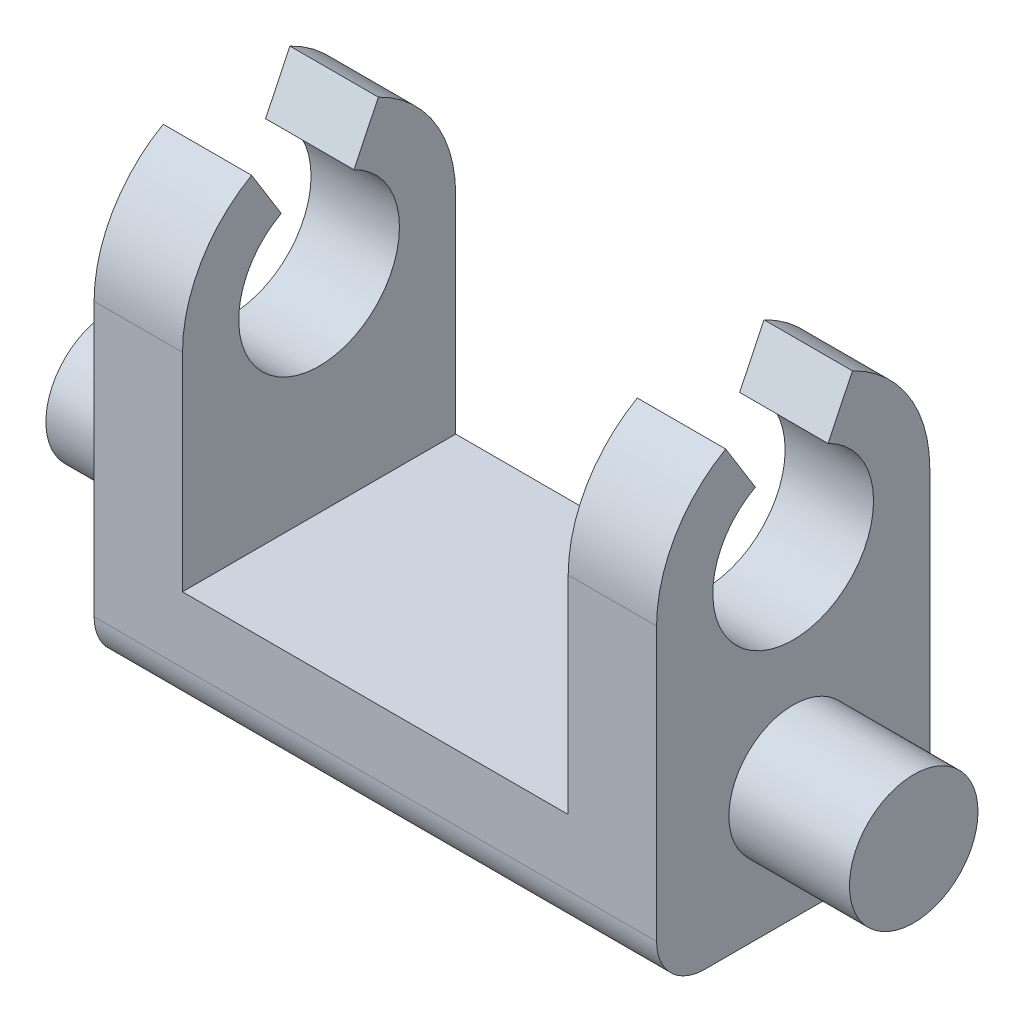
ISO-10303-21;
HEADER;
FILE_DESCRIPTION(('STEP AP214'),'2;1');
FILE_NAME('part.step','',(''),(''),'','','');
FILE_SCHEMA(('AUTOMOTIVE_DESIGN { 1 0 10303 214 1 1 1 1 }'));
ENDSEC;
DATA;
#1=APPLICATION_CONTEXT('core data for automotive mechanical design processes');
#2=APPLICATION_PROTOCOL_DEFINITION('international standard','automotive_design',2000,#1);
#3=PRODUCT_CONTEXT('',#1,'mechanical');
#4=PRODUCT('Part','Part','',(#3));
#5=PRODUCT_RELATED_PRODUCT_CATEGORY('part','',(#4));
#6=PRODUCT_DEFINITION_FORMATION('','',#4);
#7=PRODUCT_DEFINITION_CONTEXT('part definition',#1,'design');
#8=PRODUCT_DEFINITION('design','',#6,#7);
#9=PRODUCT_DEFINITION_SHAPE('','',#8);
#10=(LENGTH_UNIT() NAMED_UNIT(*) SI_UNIT(.MILLI.,.METRE.));
#11=(NAMED_UNIT(*) PLANE_ANGLE_UNIT() SI_UNIT($,.RADIAN.));
#12=(NAMED_UNIT(*) SI_UNIT($,.STERADIAN.) SOLID_ANGLE_UNIT());
#13=UNCERTAINTY_MEASURE_WITH_UNIT(LENGTH_MEASURE(1.E-05),#10,'distance_accuracy_value','');
#14=(GEOMETRIC_REPRESENTATION_CONTEXT(3) GLOBAL_UNCERTAINTY_ASSIGNED_CONTEXT((#13)) GLOBAL_UNIT_ASSIGNED_CONTEXT((#10,
#11,#12)) REPRESENTATION_CONTEXT('',''));
#15=CARTESIAN_POINT('',(0.,0.,0.));
#16=DIRECTION('',(0.,0.,1.));
#17=DIRECTION('',(1.,0.,0.));
#18=AXIS2_PLACEMENT_3D('',#15,#16,#17);
#19=CARTESIAN_POINT('',(35.,25.,0.));
#20=DIRECTION('',(-1.,0.,0.));
#21=DIRECTION('',(0.,0.,1.));
#22=AXIS2_PLACEMENT_3D('',#19,#20,#21);
#23=CYLINDRICAL_SURFACE('',#22,17.);
#24=CARTESIAN_POINT('',(24.,25.,0.));
#25=DIRECTION('',(1.,0.,0.));
#26=DIRECTION('',(0.,0.,-1.));
#27=AXIS2_PLACEMENT_3D('',#24,#25,#26);
#28=CIRCLE('',#27,17.);
#29=CARTESIAN_POINT('',(24.,25.,-17.));
#30=VERTEX_POINT('',#29);
#31=CARTESIAN_POINT('',(24.,40.3168932242542,-7.37514623290935));
#32=VERTEX_POINT('',#31);
#33=EDGE_CURVE('E280',#30,#32,#28,.T.);
#34=ORIENTED_EDGE('',*,*,#33,.T.);
#35=DIRECTION('',(1.,0.,0.));
#36=VECTOR('',#35,1.);
#37=CARTESIAN_POINT('',(-52.7667018875927,40.3168932242542,-7.37514623290935));
#38=LINE('',#37,#36);
#39=CARTESIAN_POINT('',(35.,40.3168932242542,-7.37514623290935));
#40=VERTEX_POINT('',#39);
#41=EDGE_CURVE('E56',#32,#40,#38,.T.);
#42=ORIENTED_EDGE('',*,*,#41,.T.);
#43=CARTESIAN_POINT('',(35.,25.,0.));
#44=DIRECTION('',(1.,0.,0.));
#45=DIRECTION('',(0.,0.,-1.));
#46=AXIS2_PLACEMENT_3D('',#43,#44,#45);
#47=CIRCLE('',#46,17.);
#48=CARTESIAN_POINT('',(35.,25.,-17.));
#49=VERTEX_POINT('',#48);
#50=EDGE_CURVE('E189',#49,#40,#47,.T.);
#51=ORIENTED_EDGE('',*,*,#50,.F.);
#52=DIRECTION('',(-1.,0.,0.));
#53=VECTOR('',#52,1.);
#54=CARTESIAN_POINT('',(35.,25.,-17.));
#55=LINE('',#54,#53);
#56=EDGE_CURVE('E222',#49,#30,#55,.T.);
#57=ORIENTED_EDGE('',*,*,#56,.T.);
#58=EDGE_LOOP('',(#34,#42,#51,#57));
#59=FACE_BOUND('',#58,.T.);
#60=ADVANCED_FACE('F41',(#59),#23,.T.);
#61=CARTESIAN_POINT('',(-35.,25.,0.));
#62=DIRECTION('',(1.,0.,0.));
#63=DIRECTION('',(0.,0.,-1.));
#64=AXIS2_PLACEMENT_3D('',#61,#62,#63);
#65=CIRCLE('',#64,17.);
#66=CARTESIAN_POINT('',(-35.,25.,-17.));
#67=VERTEX_POINT('',#66);
#68=CARTESIAN_POINT('',(-35.,40.3168932242542,-7.37514623290935));
#69=VERTEX_POINT('',#68);
#70=EDGE_CURVE('E211',#67,#69,#65,.T.);
#71=ORIENTED_EDGE('',*,*,#70,.T.);
#72=CARTESIAN_POINT('',(-24.,40.3168932242542,-7.37514623290935));
#73=VERTEX_POINT('',#72);
#74=EDGE_CURVE('E301',#69,#73,#38,.T.);
#75=ORIENTED_EDGE('',*,*,#74,.T.);
#76=CARTESIAN_POINT('',(-24.,25.,0.));
#77=DIRECTION('',(-1.,0.,0.));
#78=DIRECTION('',(0.,0.,1.));
#79=AXIS2_PLACEMENT_3D('',#76,#77,#78);
#80=CIRCLE('',#79,17.);
#81=CARTESIAN_POINT('',(-24.,25.,-17.));
#82=VERTEX_POINT('',#81);
#83=EDGE_CURVE('E254',#73,#82,#80,.T.);
#84=ORIENTED_EDGE('',*,*,#83,.T.);
#85=EDGE_CURVE('E210',#82,#67,#55,.T.);
#86=ORIENTED_EDGE('',*,*,#85,.T.);
#87=EDGE_LOOP('',(#71,#75,#84,#86));
#88=FACE_BOUND('',#87,.T.);
#89=ADVANCED_FACE('F345',(#88),#23,.T.);
#90=CARTESIAN_POINT('',(35.,39.7807352499064,8.39820608655049));
#91=VERTEX_POINT('',#90);
#92=CARTESIAN_POINT('',(35.,25.,17.));
#93=VERTEX_POINT('',#92);
#94=EDGE_CURVE('E180',#91,#93,#47,.T.);
#95=ORIENTED_EDGE('',*,*,#94,.F.);
#96=DIRECTION('',(1.,0.,0.));
#97=VECTOR('',#96,1.);
#98=CARTESIAN_POINT('',(-52.7667018875927,39.7807352499064,8.39820608655049));
#99=LINE('',#98,#97);
#100=CARTESIAN_POINT('',(24.,39.7807352499064,8.39820608655049));
#101=VERTEX_POINT('',#100);
#102=EDGE_CURVE('E164',#101,#91,#99,.T.);
#103=ORIENTED_EDGE('',*,*,#102,.F.);
#104=CARTESIAN_POINT('',(24.,25.,17.));
#105=VERTEX_POINT('',#104);
#106=EDGE_CURVE('E258',#101,#105,#28,.T.);
#107=ORIENTED_EDGE('',*,*,#106,.T.);
#108=DIRECTION('',(-1.,0.,0.));
#109=VECTOR('',#108,1.);
#110=CARTESIAN_POINT('',(35.,25.,17.));
#111=LINE('',#110,#109);
#112=EDGE_CURVE('E188',#93,#105,#111,.T.);
#113=ORIENTED_EDGE('',*,*,#112,.F.);
#114=EDGE_LOOP('',(#95,#103,#107,#113));
#115=FACE_BOUND('',#114,.T.);
#116=ADVANCED_FACE('F186',(#115),#23,.T.);
#117=CARTESIAN_POINT('',(35.,25.,0.));
#118=DIRECTION('',(-1.,0.,0.));
#119=DIRECTION('',(0.,0.,1.));
#120=AXIS2_PLACEMENT_3D('',#117,#118,#119);
#121=CYLINDRICAL_SURFACE('',#120,10.);
#122=DIRECTION('',(1.,0.,0.));
#123=VECTOR('',#122,1.);
#124=CARTESIAN_POINT('',(-52.7667018875927,34.0099371907378,-4.33832131347609));
#125=LINE('',#124,#123);
#126=CARTESIAN_POINT('',(24.,34.0099371907378,-4.33832131347609));
#127=VERTEX_POINT('',#126);
#128=CARTESIAN_POINT('',(35.,34.0099371907378,-4.33832131347609));
#129=VERTEX_POINT('',#128);
#130=EDGE_CURVE('E299',#127,#129,#125,.T.);
#131=ORIENTED_EDGE('',*,*,#130,.F.);
#132=CARTESIAN_POINT('',(24.,25.,0.));
#133=DIRECTION('',(1.,0.,0.));
#134=DIRECTION('',(0.,0.,-1.));
#135=AXIS2_PLACEMENT_3D('',#132,#133,#134);
#136=CIRCLE('',#135,10.);
#137=CARTESIAN_POINT('',(24.,33.8233837946997,4.70615537476522));
#138=VERTEX_POINT('',#137);
#139=EDGE_CURVE('E256',#138,#127,#136,.T.);
#140=ORIENTED_EDGE('',*,*,#139,.F.);
#141=DIRECTION('',(1.,0.,0.));
#142=VECTOR('',#141,1.);
#143=CARTESIAN_POINT('',(-52.7667018875927,33.8233837946997,4.70615537476522));
#144=LINE('',#143,#142);
#145=CARTESIAN_POINT('',(35.,33.8233837946997,4.70615537476522));
#146=VERTEX_POINT('',#145);
#147=EDGE_CURVE('E64',#138,#146,#144,.T.);
#148=ORIENTED_EDGE('',*,*,#147,.T.);
#149=CARTESIAN_POINT('',(35.,25.,0.));
#150=DIRECTION('',(1.,0.,0.));
#151=DIRECTION('',(0.,0.,-1.));
#152=AXIS2_PLACEMENT_3D('',#149,#150,#151);
#153=CIRCLE('',#152,10.);
#154=EDGE_CURVE('E183',#146,#129,#153,.T.);
#155=ORIENTED_EDGE('',*,*,#154,.T.);
#156=EDGE_LOOP('',(#131,#140,#148,#155));
#157=FACE_BOUND('',#156,.T.);
#158=ADVANCED_FACE('F339',(#157),#121,.F.);
#159=CARTESIAN_POINT('',(50.,0.,0.));
#160=DIRECTION('',(-1.,0.,0.));
#161=DIRECTION('',(0.,0.,1.));
#162=AXIS2_PLACEMENT_3D('',#159,#160,#161);
#163=CYLINDRICAL_SURFACE('',#162,8.);
#164=CARTESIAN_POINT('',(35.,0.,0.));
#165=DIRECTION('',(1.,0.,0.));
#166=DIRECTION('',(0.,0.,-1.));
#167=AXIS2_PLACEMENT_3D('',#164,#165,#166);
#168=CIRCLE('',#167,8.);
#169=CARTESIAN_POINT('',(35.,0.,-8.));
#170=VERTEX_POINT('',#169);
#171=EDGE_CURVE('E239',#170,#170,#168,.T.);
#172=ORIENTED_EDGE('',*,*,#171,.T.);
#173=EDGE_LOOP('',(#172));
#174=FACE_BOUND('',#173,.T.);
#175=CARTESIAN_POINT('',(50.,0.,0.));
#176=DIRECTION('',(1.,0.,0.));
#177=DIRECTION('',(0.,0.,-1.));
#178=AXIS2_PLACEMENT_3D('',#175,#176,#177);
#179=CIRCLE('',#178,8.);
#180=CARTESIAN_POINT('',(50.,0.,-8.));
#181=VERTEX_POINT('',#180);
#182=EDGE_CURVE('E240',#181,#181,#179,.T.);
#183=ORIENTED_EDGE('',*,*,#182,.F.);
#184=EDGE_LOOP('',(#183));
#185=FACE_BOUND('',#184,.T.);
#186=ADVANCED_FACE('F43',(#174,#185),#163,.T.);
#187=CARTESIAN_POINT('',(50.,0.,0.));
#188=DIRECTION('',(1.,0.,0.));
#189=DIRECTION('',(0.,0.,-1.));
#190=AXIS2_PLACEMENT_3D('',#187,#188,#189);
#191=PLANE('',#190);
#192=ORIENTED_EDGE('',*,*,#182,.T.);
#193=EDGE_LOOP('',(#192));
#194=FACE_BOUND('',#193,.T.);
#195=ADVANCED_FACE('F395',(#194),#191,.T.);
#196=CARTESIAN_POINT('',(35.,25.,0.));
#197=DIRECTION('',(1.,0.,0.));
#198=DIRECTION('',(0.,0.,-1.));
#199=AXIS2_PLACEMENT_3D('',#196,#197,#198);
#200=PLANE('',#199);
#201=DIRECTION('',(0.,0.900993719073774,-0.433832131347609));
#202=VECTOR('',#201,1.);
#203=CARTESIAN_POINT('',(35.,40.3168932242542,-7.37514623290935));
#204=LINE('',#203,#202);
#205=EDGE_CURVE('E173',#129,#40,#204,.T.);
#206=ORIENTED_EDGE('',*,*,#205,.F.);
#207=ORIENTED_EDGE('',*,*,#154,.F.);
#208=DIRECTION('',(0.,-0.849998985750322,-0.526784324200544));
#209=VECTOR('',#208,1.);
#210=CARTESIAN_POINT('',(35.,39.7807352499064,8.39820608655049));
#211=LINE('',#210,#209);
#212=EDGE_CURVE('E167',#91,#146,#211,.T.);
#213=ORIENTED_EDGE('',*,*,#212,.F.);
#214=ORIENTED_EDGE('',*,*,#94,.T.);
#215=DIRECTION('',(0.,-1.,0.));
#216=VECTOR('',#215,1.);
#217=CARTESIAN_POINT('',(35.,25.,17.));
#218=LINE('',#217,#216);
#219=CARTESIAN_POINT('',(35.,-9.,17.));
#220=VERTEX_POINT('',#219);
#221=EDGE_CURVE('E193',#93,#220,#218,.T.);
#222=ORIENTED_EDGE('',*,*,#221,.T.);
#223=CARTESIAN_POINT('',(35.,-9.,11.));
#224=DIRECTION('',(1.,0.,0.));
#225=DIRECTION('',(0.,0.,1.));
#226=AXIS2_PLACEMENT_3D('',#223,#224,#225);
#227=CIRCLE('',#226,6.);
#228=CARTESIAN_POINT('',(35.,-15.,11.));
#229=VERTEX_POINT('',#228);
#230=EDGE_CURVE('E202',#220,#229,#227,.T.);
#231=ORIENTED_EDGE('',*,*,#230,.T.);
#232=DIRECTION('',(0.,0.,-1.));
#233=VECTOR('',#232,1.);
#234=CARTESIAN_POINT('',(35.,-15.,11.));
#235=LINE('',#234,#233);
#236=CARTESIAN_POINT('',(35.,-15.,-11.));
#237=VERTEX_POINT('',#236);
#238=EDGE_CURVE('E204',#229,#237,#235,.T.);
#239=ORIENTED_EDGE('',*,*,#238,.T.);
#240=CARTESIAN_POINT('',(35.,-9.,-11.));
#241=DIRECTION('',(1.,0.,0.));
#242=DIRECTION('',(0.,0.,-1.));
#243=AXIS2_PLACEMENT_3D('',#240,#241,#242);
#244=CIRCLE('',#243,6.);
#245=CARTESIAN_POINT('',(35.,-8.99999999999996,-17.));
#246=VERTEX_POINT('',#245);
#247=EDGE_CURVE('E206',#237,#246,#244,.T.);
#248=ORIENTED_EDGE('',*,*,#247,.T.);
#249=DIRECTION('',(0.,1.,0.));
#250=VECTOR('',#249,1.);
#251=CARTESIAN_POINT('',(35.,-8.99999999999996,-17.));
#252=LINE('',#251,#250);
#253=EDGE_CURVE('E208',#246,#49,#252,.T.);
#254=ORIENTED_EDGE('',*,*,#253,.T.);
#255=ORIENTED_EDGE('',*,*,#50,.T.);
#256=EDGE_LOOP('',(#206,#207,#213,#214,#222,#231,#239,#248,#254,#255));
#257=FACE_BOUND('',#256,.T.);
#258=ORIENTED_EDGE('',*,*,#171,.F.);
#259=EDGE_LOOP('',(#258));
#260=FACE_BOUND('',#259,.T.);
#261=ADVANCED_FACE('F178',(#257,#260),#200,.T.);
#262=CARTESIAN_POINT('',(-35.,25.,0.));
#263=DIRECTION('',(1.,0.,0.));
#264=DIRECTION('',(0.,0.,-1.));
#265=AXIS2_PLACEMENT_3D('',#262,#263,#264);
#266=PLANE('',#265);
#267=CARTESIAN_POINT('',(-35.,0.,0.));
#268=DIRECTION('',(1.,0.,0.));
#269=DIRECTION('',(0.,0.,-1.));
#270=AXIS2_PLACEMENT_3D('',#267,#268,#269);
#271=CIRCLE('',#270,8.);
#272=CARTESIAN_POINT('',(-35.,0.,-8.));
#273=VERTEX_POINT('',#272);
#274=EDGE_CURVE('E243',#273,#273,#271,.T.);
#275=ORIENTED_EDGE('',*,*,#274,.T.);
#276=EDGE_LOOP('',(#275));
#277=FACE_BOUND('',#276,.T.);
#278=CARTESIAN_POINT('',(-35.,25.,0.));
#279=DIRECTION('',(1.,0.,0.));
#280=DIRECTION('',(0.,0.,-1.));
#281=AXIS2_PLACEMENT_3D('',#278,#279,#280);
#282=CIRCLE('',#281,10.);
#283=CARTESIAN_POINT('',(-35.,33.8233837946997,4.70615537476522));
#284=VERTEX_POINT('',#283);
#285=CARTESIAN_POINT('',(-35.,34.0099371907378,-4.33832131347609));
#286=VERTEX_POINT('',#285);
#287=EDGE_CURVE('E199',#284,#286,#282,.T.);
#288=ORIENTED_EDGE('',*,*,#287,.T.);
#289=DIRECTION('',(0.,-0.900993719073774,0.433832131347609));
#290=VECTOR('',#289,1.);
#291=CARTESIAN_POINT('',(-35.,40.3168932242542,-7.37514623290935));
#292=LINE('',#291,#290);
#293=EDGE_CURVE('E291',#69,#286,#292,.T.);
#294=ORIENTED_EDGE('',*,*,#293,.F.);
#295=ORIENTED_EDGE('',*,*,#70,.F.);
#296=DIRECTION('',(0.,1.,0.));
#297=VECTOR('',#296,1.);
#298=CARTESIAN_POINT('',(-35.,-8.99999999999996,-17.));
#299=LINE('',#298,#297);
#300=CARTESIAN_POINT('',(-35.,-8.99999999999996,-17.));
#301=VERTEX_POINT('',#300);
#302=EDGE_CURVE('E190',#301,#67,#299,.T.);
#303=ORIENTED_EDGE('',*,*,#302,.F.);
#304=CARTESIAN_POINT('',(-35.,-9.,-11.));
#305=DIRECTION('',(1.,0.,0.));
#306=DIRECTION('',(0.,0.,-1.));
#307=AXIS2_PLACEMENT_3D('',#304,#305,#306);
#308=CIRCLE('',#307,6.);
#309=CARTESIAN_POINT('',(-35.,-15.,-11.));
#310=VERTEX_POINT('',#309);
#311=EDGE_CURVE('E195',#310,#301,#308,.T.);
#312=ORIENTED_EDGE('',*,*,#311,.F.);
#313=DIRECTION('',(0.,0.,-1.));
#314=VECTOR('',#313,1.);
#315=CARTESIAN_POINT('',(-35.,-15.,11.));
#316=LINE('',#315,#314);
#317=CARTESIAN_POINT('',(-35.,-15.,11.));
#318=VERTEX_POINT('',#317);
#319=EDGE_CURVE('E219',#318,#310,#316,.T.);
#320=ORIENTED_EDGE('',*,*,#319,.F.);
#321=CARTESIAN_POINT('',(-35.,-9.,11.));
#322=DIRECTION('',(1.,0.,0.));
#323=DIRECTION('',(0.,0.,1.));
#324=AXIS2_PLACEMENT_3D('',#321,#322,#323);
#325=CIRCLE('',#324,6.);
#326=CARTESIAN_POINT('',(-35.,-9.,17.));
#327=VERTEX_POINT('',#326);
#328=EDGE_CURVE('E217',#327,#318,#325,.T.);
#329=ORIENTED_EDGE('',*,*,#328,.F.);
#330=DIRECTION('',(0.,-1.,0.));
#331=VECTOR('',#330,1.);
#332=CARTESIAN_POINT('',(-35.,25.,17.));
#333=LINE('',#332,#331);
#334=CARTESIAN_POINT('',(-35.,25.,17.));
#335=VERTEX_POINT('',#334);
#336=EDGE_CURVE('E214',#335,#327,#333,.T.);
#337=ORIENTED_EDGE('',*,*,#336,.F.);
#338=CARTESIAN_POINT('',(-35.,39.7807352499064,8.39820608655049));
#339=VERTEX_POINT('',#338);
#340=EDGE_CURVE('E215',#339,#335,#65,.T.);
#341=ORIENTED_EDGE('',*,*,#340,.F.);
#342=DIRECTION('',(0.,0.849998985750322,0.526784324200544));
#343=VECTOR('',#342,1.);
#344=CARTESIAN_POINT('',(-35.,39.7807352499064,8.39820608655049));
#345=LINE('',#344,#343);
#346=EDGE_CURVE('E292',#284,#339,#345,.T.);
#347=ORIENTED_EDGE('',*,*,#346,.F.);
#348=EDGE_LOOP('',(#288,#294,#295,#303,#312,#320,#329,#337,#341,#347));
#349=FACE_BOUND('',#348,.T.);
#350=ADVANCED_FACE('F289',(#277,#349),#266,.F.);
#351=CARTESIAN_POINT('',(-24.,25.,17.));
#352=VERTEX_POINT('',#351);
#353=CARTESIAN_POINT('',(-24.,39.7807352499064,8.3982060865505));
#354=VERTEX_POINT('',#353);
#355=EDGE_CURVE('E259',#352,#354,#80,.T.);
#356=ORIENTED_EDGE('',*,*,#355,.T.);
#357=EDGE_CURVE('E172',#339,#354,#99,.T.);
#358=ORIENTED_EDGE('',*,*,#357,.F.);
#359=ORIENTED_EDGE('',*,*,#340,.T.);
#360=EDGE_CURVE('E237',#352,#335,#111,.T.);
#361=ORIENTED_EDGE('',*,*,#360,.F.);
#362=EDGE_LOOP('',(#356,#358,#359,#361));
#363=FACE_BOUND('',#362,.T.);
#364=ADVANCED_FACE('F272',(#363),#23,.T.);
#365=CARTESIAN_POINT('',(35.,25.,17.));
#366=DIRECTION('',(0.,0.,-1.));
#367=DIRECTION('',(-1.,0.,0.));
#368=AXIS2_PLACEMENT_3D('',#365,#366,#367);
#369=PLANE('',#368);
#370=ORIENTED_EDGE('',*,*,#112,.T.);
#371=DIRECTION('',(0.,1.,0.));
#372=VECTOR('',#371,1.);
#373=CARTESIAN_POINT('',(24.,-0.809999999999984,17.));
#374=LINE('',#373,#372);
#375=CARTESIAN_POINT('',(24.,-0.809999999999984,17.));
#376=VERTEX_POINT('',#375);
#377=EDGE_CURVE('E315',#376,#105,#374,.T.);
#378=ORIENTED_EDGE('',*,*,#377,.F.);
#379=DIRECTION('',(1.,0.,0.));
#380=VECTOR('',#379,1.);
#381=CARTESIAN_POINT('',(-24.,-0.809999999999984,17.));
#382=LINE('',#381,#380);
#383=CARTESIAN_POINT('',(-24.,-0.809999999999984,17.));
#384=VERTEX_POINT('',#383);
#385=EDGE_CURVE('E312',#384,#376,#382,.T.);
#386=ORIENTED_EDGE('',*,*,#385,.F.);
#387=DIRECTION('',(0.,-1.,0.));
#388=VECTOR('',#387,1.);
#389=CARTESIAN_POINT('',(-24.,42.,17.));
#390=LINE('',#389,#388);
#391=EDGE_CURVE('E310',#352,#384,#390,.T.);
#392=ORIENTED_EDGE('',*,*,#391,.F.);
#393=ORIENTED_EDGE('',*,*,#360,.T.);
#394=ORIENTED_EDGE('',*,*,#336,.T.);
#395=DIRECTION('',(-1.,0.,0.));
#396=VECTOR('',#395,1.);
#397=CARTESIAN_POINT('',(35.,-9.,17.));
#398=LINE('',#397,#396);
#399=EDGE_CURVE('E234',#220,#327,#398,.T.);
#400=ORIENTED_EDGE('',*,*,#399,.F.);
#401=ORIENTED_EDGE('',*,*,#221,.F.);
#402=EDGE_LOOP('',(#370,#378,#386,#392,#393,#394,#400,#401));
#403=FACE_BOUND('',#402,.T.);
#404=ADVANCED_FACE('F336',(#403),#369,.F.);
#405=CARTESIAN_POINT('',(35.,-9.,11.));
#406=DIRECTION('',(-1.,0.,0.));
#407=DIRECTION('',(0.,0.,1.));
#408=AXIS2_PLACEMENT_3D('',#405,#406,#407);
#409=CYLINDRICAL_SURFACE('',#408,6.);
#410=ORIENTED_EDGE('',*,*,#328,.T.);
#411=DIRECTION('',(-1.,0.,0.));
#412=VECTOR('',#411,1.);
#413=CARTESIAN_POINT('',(35.,-15.,11.));
#414=LINE('',#413,#412);
#415=EDGE_CURVE('E231',#229,#318,#414,.T.);
#416=ORIENTED_EDGE('',*,*,#415,.F.);
#417=ORIENTED_EDGE('',*,*,#230,.F.);
#418=ORIENTED_EDGE('',*,*,#399,.T.);
#419=EDGE_LOOP('',(#410,#416,#417,#418));
#420=FACE_BOUND('',#419,.T.);
#421=ADVANCED_FACE('F365',(#420),#409,.T.);
#422=CARTESIAN_POINT('',(35.,-15.,11.));
#423=DIRECTION('',(0.,1.,0.));
#424=DIRECTION('',(0.,0.,1.));
#425=AXIS2_PLACEMENT_3D('',#422,#423,#424);
#426=PLANE('',#425);
#427=ORIENTED_EDGE('',*,*,#319,.T.);
#428=DIRECTION('',(-1.,0.,0.));
#429=VECTOR('',#428,1.);
#430=CARTESIAN_POINT('',(35.,-15.,-11.));
#431=LINE('',#430,#429);
#432=EDGE_CURVE('E228',#237,#310,#431,.T.);
#433=ORIENTED_EDGE('',*,*,#432,.F.);
#434=ORIENTED_EDGE('',*,*,#238,.F.);
#435=ORIENTED_EDGE('',*,*,#415,.T.);
#436=EDGE_LOOP('',(#427,#433,#434,#435));
#437=FACE_BOUND('',#436,.T.);
#438=ADVANCED_FACE('F361',(#437),#426,.F.);
#439=CARTESIAN_POINT('',(35.,-9.,-11.));
#440=DIRECTION('',(-1.,0.,0.));
#441=DIRECTION('',(0.,0.,1.));
#442=AXIS2_PLACEMENT_3D('',#439,#440,#441);
#443=CYLINDRICAL_SURFACE('',#442,6.);
#444=ORIENTED_EDGE('',*,*,#311,.T.);
#445=DIRECTION('',(-1.,0.,0.));
#446=VECTOR('',#445,1.);
#447=CARTESIAN_POINT('',(35.,-8.99999999999996,-17.));
#448=LINE('',#447,#446);
#449=EDGE_CURVE('E225',#246,#301,#448,.T.);
#450=ORIENTED_EDGE('',*,*,#449,.F.);
#451=ORIENTED_EDGE('',*,*,#247,.F.);
#452=ORIENTED_EDGE('',*,*,#432,.T.);
#453=EDGE_LOOP('',(#444,#450,#451,#452));
#454=FACE_BOUND('',#453,.T.);
#455=ADVANCED_FACE('F356',(#454),#443,.T.);
#456=CARTESIAN_POINT('',(35.,-8.99999999999996,-17.));
#457=DIRECTION('',(0.,0.,1.));
#458=DIRECTION('',(1.,0.,0.));
#459=AXIS2_PLACEMENT_3D('',#456,#457,#458);
#460=PLANE('',#459);
#461=DIRECTION('',(1.,0.,0.));
#462=VECTOR('',#461,1.);
#463=CARTESIAN_POINT('',(-24.,-0.809999999999984,-17.));
#464=LINE('',#463,#462);
#465=CARTESIAN_POINT('',(-24.,-0.809999999999984,-17.));
#466=VERTEX_POINT('',#465);
#467=CARTESIAN_POINT('',(24.,-0.809999999999984,-17.));
#468=VERTEX_POINT('',#467);
#469=EDGE_CURVE('E321',#466,#468,#464,.T.);
#470=ORIENTED_EDGE('',*,*,#469,.T.);
#471=DIRECTION('',(0.,1.,0.));
#472=VECTOR('',#471,1.);
#473=CARTESIAN_POINT('',(24.,-0.809999999999984,-17.));
#474=LINE('',#473,#472);
#475=EDGE_CURVE('E324',#468,#30,#474,.T.);
#476=ORIENTED_EDGE('',*,*,#475,.T.);
#477=ORIENTED_EDGE('',*,*,#56,.F.);
#478=ORIENTED_EDGE('',*,*,#253,.F.);
#479=ORIENTED_EDGE('',*,*,#449,.T.);
#480=ORIENTED_EDGE('',*,*,#302,.T.);
#481=ORIENTED_EDGE('',*,*,#85,.F.);
#482=DIRECTION('',(0.,-1.,0.));
#483=VECTOR('',#482,1.);
#484=CARTESIAN_POINT('',(-24.,42.,-17.));
#485=LINE('',#484,#483);
#486=EDGE_CURVE('E318',#82,#466,#485,.T.);
#487=ORIENTED_EDGE('',*,*,#486,.T.);
#488=EDGE_LOOP('',(#470,#476,#477,#478,#479,#480,#481,#487));
#489=FACE_BOUND('',#488,.T.);
#490=ADVANCED_FACE('F348',(#489),#460,.F.);
#491=CARTESIAN_POINT('',(-24.,34.0099371907378,-4.33832131347609));
#492=VERTEX_POINT('',#491);
#493=EDGE_CURVE('E297',#286,#492,#125,.T.);
#494=ORIENTED_EDGE('',*,*,#493,.F.);
#495=ORIENTED_EDGE('',*,*,#287,.F.);
#496=CARTESIAN_POINT('',(-24.,33.8233837946997,4.70615537476522));
#497=VERTEX_POINT('',#496);
#498=EDGE_CURVE('E296',#284,#497,#144,.T.);
#499=ORIENTED_EDGE('',*,*,#498,.T.);
#500=CARTESIAN_POINT('',(-24.,25.,0.));
#501=DIRECTION('',(-1.,0.,0.));
#502=DIRECTION('',(0.,0.,1.));
#503=AXIS2_PLACEMENT_3D('',#500,#501,#502);
#504=CIRCLE('',#503,10.);
#505=EDGE_CURVE('E251',#492,#497,#504,.T.);
#506=ORIENTED_EDGE('',*,*,#505,.F.);
#507=EDGE_LOOP('',(#494,#495,#499,#506));
#508=FACE_BOUND('',#507,.T.);
#509=ADVANCED_FACE('F295',(#508),#121,.F.);
#510=CARTESIAN_POINT('',(-50.,0.,0.));
#511=DIRECTION('',(1.,0.,0.));
#512=DIRECTION('',(0.,0.,-1.));
#513=AXIS2_PLACEMENT_3D('',#510,#511,#512);
#514=PLANE('',#513);
#515=CARTESIAN_POINT('',(-50.,0.,0.));
#516=DIRECTION('',(1.,0.,0.));
#517=DIRECTION('',(0.,0.,-1.));
#518=AXIS2_PLACEMENT_3D('',#515,#516,#517);
#519=CIRCLE('',#518,8.);
#520=CARTESIAN_POINT('',(-50.,0.,-8.));
#521=VERTEX_POINT('',#520);
#522=EDGE_CURVE('E244',#521,#521,#519,.T.);
#523=ORIENTED_EDGE('',*,*,#522,.F.);
#524=EDGE_LOOP('',(#523));
#525=FACE_BOUND('',#524,.T.);
#526=ADVANCED_FACE('F400',(#525),#514,.F.);
#527=ORIENTED_EDGE('',*,*,#522,.T.);
#528=EDGE_LOOP('',(#527));
#529=FACE_BOUND('',#528,.T.);
#530=ORIENTED_EDGE('',*,*,#274,.F.);
#531=EDGE_LOOP('',(#530));
#532=FACE_BOUND('',#531,.T.);
#533=ADVANCED_FACE('F397',(#529,#532),#163,.T.);
#534=CARTESIAN_POINT('',(24.,-0.809999999999984,-17.));
#535=DIRECTION('',(1.,0.,0.));
#536=DIRECTION('',(0.,0.,-1.));
#537=AXIS2_PLACEMENT_3D('',#534,#535,#536);
#538=PLANE('',#537);
#539=ORIENTED_EDGE('',*,*,#139,.T.);
#540=DIRECTION('',(0.,0.900993719073774,-0.433832131347609));
#541=VECTOR('',#540,1.);
#542=CARTESIAN_POINT('',(24.,10.6926687455757,6.88903804832727));
#543=LINE('',#542,#541);
#544=EDGE_CURVE('E308',#127,#32,#543,.T.);
#545=ORIENTED_EDGE('',*,*,#544,.T.);
#546=ORIENTED_EDGE('',*,*,#33,.F.);
#547=ORIENTED_EDGE('',*,*,#475,.F.);
#548=DIRECTION('',(0.,0.,1.));
#549=VECTOR('',#548,1.);
#550=CARTESIAN_POINT('',(24.,-0.809999999999984,-17.));
#551=LINE('',#550,#549);
#552=EDGE_CURVE('E255',#468,#376,#551,.T.);
#553=ORIENTED_EDGE('',*,*,#552,.T.);
#554=ORIENTED_EDGE('',*,*,#377,.T.);
#555=ORIENTED_EDGE('',*,*,#106,.F.);
#556=DIRECTION('',(0.,-0.849998985750322,-0.526784324200544));
#557=VECTOR('',#556,1.);
#558=CARTESIAN_POINT('',(24.,-0.918457715454,-16.8249967892028));
#559=LINE('',#558,#557);
#560=EDGE_CURVE('E168',#101,#138,#559,.T.);
#561=ORIENTED_EDGE('',*,*,#560,.T.);
#562=EDGE_LOOP('',(#539,#545,#546,#547,#553,#554,#555,#561));
#563=FACE_BOUND('',#562,.T.);
#564=ADVANCED_FACE('F337',(#563),#538,.F.);
#565=CARTESIAN_POINT('',(-24.,42.,-17.));
#566=DIRECTION('',(-1.,0.,0.));
#567=DIRECTION('',(0.,0.,1.));
#568=AXIS2_PLACEMENT_3D('',#565,#566,#567);
#569=PLANE('',#568);
#570=ORIENTED_EDGE('',*,*,#83,.F.);
#571=DIRECTION('',(0.,-0.900993719073774,0.433832131347609));
#572=VECTOR('',#571,1.);
#573=CARTESIAN_POINT('',(-24.,45.4453850238786,-9.84453584232528));
#574=LINE('',#573,#572);
#575=EDGE_CURVE('E11',#73,#492,#574,.T.);
#576=ORIENTED_EDGE('',*,*,#575,.T.);
#577=ORIENTED_EDGE('',*,*,#505,.T.);
#578=DIRECTION('',(0.,0.849998985750322,0.526784324200544));
#579=VECTOR('',#578,1.);
#580=CARTESIAN_POINT('',(-24.,30.0116934705412,2.34387171897817));
#581=LINE('',#580,#579);
#582=EDGE_CURVE('E49',#497,#354,#581,.T.);
#583=ORIENTED_EDGE('',*,*,#582,.T.);
#584=ORIENTED_EDGE('',*,*,#355,.F.);
#585=ORIENTED_EDGE('',*,*,#391,.T.);
#586=DIRECTION('',(0.,0.,1.));
#587=VECTOR('',#586,1.);
#588=CARTESIAN_POINT('',(-24.,-0.809999999999984,-17.));
#589=LINE('',#588,#587);
#590=EDGE_CURVE('E278',#466,#384,#589,.T.);
#591=ORIENTED_EDGE('',*,*,#590,.F.);
#592=ORIENTED_EDGE('',*,*,#486,.F.);
#593=EDGE_LOOP('',(#570,#576,#577,#583,#584,#585,#591,#592));
#594=FACE_BOUND('',#593,.T.);
#595=ADVANCED_FACE('F264',(#594),#569,.F.);
#596=CARTESIAN_POINT('',(-24.,-0.809999999999984,-17.));
#597=DIRECTION('',(0.,-1.,0.));
#598=DIRECTION('',(0.,0.,-1.));
#599=AXIS2_PLACEMENT_3D('',#596,#597,#598);
#600=PLANE('',#599);
#601=ORIENTED_EDGE('',*,*,#552,.F.);
#602=ORIENTED_EDGE('',*,*,#469,.F.);
#603=ORIENTED_EDGE('',*,*,#590,.T.);
#604=ORIENTED_EDGE('',*,*,#385,.T.);
#605=EDGE_LOOP('',(#601,#602,#603,#604));
#606=FACE_BOUND('',#605,.T.);
#607=ADVANCED_FACE('F332',(#606),#600,.F.);
#608=CARTESIAN_POINT('',(-52.7667018875927,39.7807352499064,8.39820608655049));
#609=DIRECTION('',(0.,-0.526784324200544,0.849998985750322));
#610=DIRECTION('',(0.,-0.849998985750322,-0.526784324200544));
#611=AXIS2_PLACEMENT_3D('',#608,#609,#610);
#612=PLANE('',#611);
#613=ORIENTED_EDGE('',*,*,#498,.F.);
#614=ORIENTED_EDGE('',*,*,#346,.T.);
#615=ORIENTED_EDGE('',*,*,#357,.T.);
#616=ORIENTED_EDGE('',*,*,#582,.F.);
#617=EDGE_LOOP('',(#613,#614,#615,#616));
#618=FACE_BOUND('',#617,.T.);
#619=ADVANCED_FACE('F518',(#618),#612,.F.);
#620=CARTESIAN_POINT('',(-52.7667018875927,40.3168932242542,-7.37514623290935));
#621=DIRECTION('',(0.,-0.433832131347609,-0.900993719073774));
#622=DIRECTION('',(0.,0.900993719073774,-0.433832131347609));
#623=AXIS2_PLACEMENT_3D('',#620,#621,#622);
#624=PLANE('',#623);
#625=ORIENTED_EDGE('',*,*,#74,.F.);
#626=ORIENTED_EDGE('',*,*,#293,.T.);
#627=ORIENTED_EDGE('',*,*,#493,.T.);
#628=ORIENTED_EDGE('',*,*,#575,.F.);
#629=EDGE_LOOP('',(#625,#626,#627,#628));
#630=FACE_BOUND('',#629,.T.);
#631=ADVANCED_FACE('F536',(#630),#624,.F.);
#632=ORIENTED_EDGE('',*,*,#102,.T.);
#633=ORIENTED_EDGE('',*,*,#212,.T.);
#634=ORIENTED_EDGE('',*,*,#147,.F.);
#635=ORIENTED_EDGE('',*,*,#560,.F.);
#636=EDGE_LOOP('',(#632,#633,#634,#635));
#637=FACE_BOUND('',#636,.T.);
#638=ADVANCED_FACE('F166',(#637),#612,.F.);
#639=ORIENTED_EDGE('',*,*,#130,.T.);
#640=ORIENTED_EDGE('',*,*,#205,.T.);
#641=ORIENTED_EDGE('',*,*,#41,.F.);
#642=ORIENTED_EDGE('',*,*,#544,.F.);
#643=EDGE_LOOP('',(#639,#640,#641,#642));
#644=FACE_BOUND('',#643,.T.);
#645=ADVANCED_FACE('F340',(#644),#624,.F.);
#646=CLOSED_SHELL('',(#60,#89,#116,#158,#186,#195,#261,#350,#364,#404,#421,#438,#455,#490,#509,
#526,#533,#564,#595,#607,#619,#631,#638,#645));
#647=MANIFOLD_SOLID_BREP('B2',#646);
#648=ADVANCED_BREP_SHAPE_REPRESENTATION('',(#18,#647),#14);
#649=SHAPE_DEFINITION_REPRESENTATION(#9,#648);
ENDSEC;
END-ISO-10303-21;
